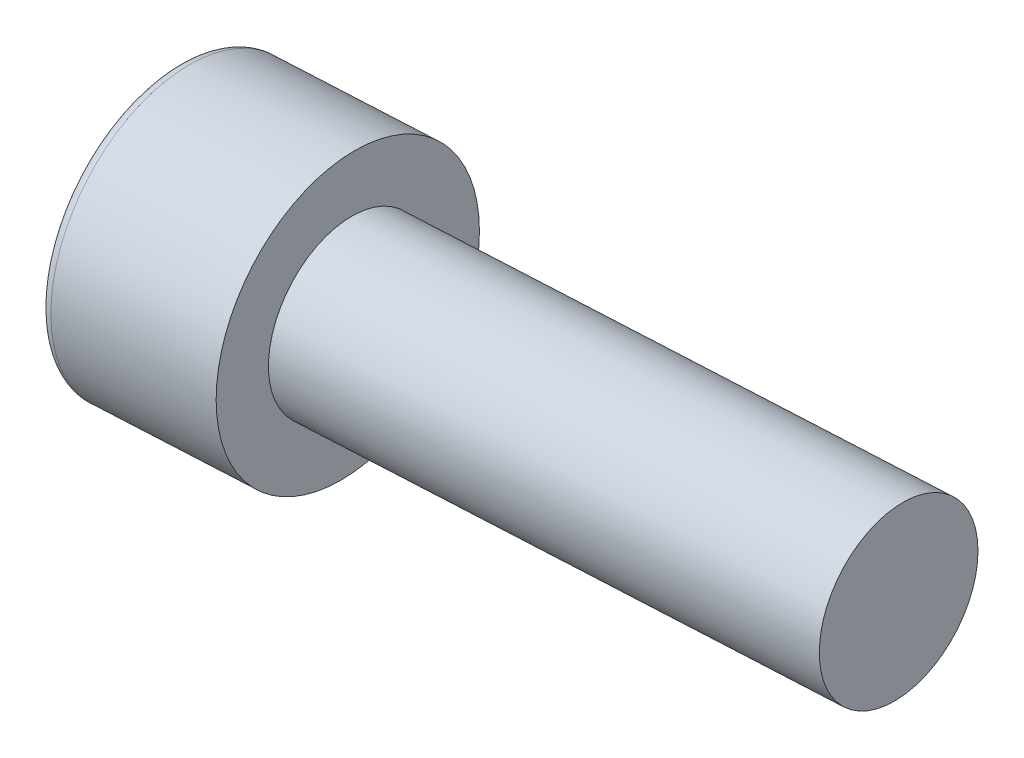
ISO-10303-21;
HEADER;
FILE_DESCRIPTION(('STEP AP214'),'2;1');
FILE_NAME('part.step','',(''),(''),'','','');
FILE_SCHEMA(('AUTOMOTIVE_DESIGN { 1 0 10303 214 1 1 1 1 }'));
ENDSEC;
DATA;
#1=APPLICATION_CONTEXT('core data for automotive mechanical design processes');
#2=APPLICATION_PROTOCOL_DEFINITION('international standard','automotive_design',2000,#1);
#3=PRODUCT_CONTEXT('',#1,'mechanical');
#4=PRODUCT('Part','Part','',(#3));
#5=PRODUCT_RELATED_PRODUCT_CATEGORY('part','',(#4));
#6=PRODUCT_DEFINITION_FORMATION('','',#4);
#7=PRODUCT_DEFINITION_CONTEXT('part definition',#1,'design');
#8=PRODUCT_DEFINITION('design','',#6,#7);
#9=PRODUCT_DEFINITION_SHAPE('','',#8);
#10=(LENGTH_UNIT() NAMED_UNIT(*) SI_UNIT(.MILLI.,.METRE.));
#11=(NAMED_UNIT(*) PLANE_ANGLE_UNIT() SI_UNIT($,.RADIAN.));
#12=(NAMED_UNIT(*) SI_UNIT($,.STERADIAN.) SOLID_ANGLE_UNIT());
#13=UNCERTAINTY_MEASURE_WITH_UNIT(LENGTH_MEASURE(1.E-05),#10,'distance_accuracy_value','');
#14=(GEOMETRIC_REPRESENTATION_CONTEXT(3) GLOBAL_UNCERTAINTY_ASSIGNED_CONTEXT((#13)) GLOBAL_UNIT_ASSIGNED_CONTEXT((#10,
#11,#12)) REPRESENTATION_CONTEXT('',''));
#15=CARTESIAN_POINT('',(0.,0.,0.));
#16=DIRECTION('',(0.,0.,1.));
#17=DIRECTION('',(1.,0.,0.));
#18=AXIS2_PLACEMENT_3D('',#15,#16,#17);
#19=CARTESIAN_POINT('',(215.429162244567,-73.9736896629807,1521.39447916702));
#20=DIRECTION('',(-0.998629534754574,0.,0.0523359562429378));
#21=DIRECTION('',(0.0523359562429378,0.,0.998629534754574));
#22=AXIS2_PLACEMENT_3D('',#19,#20,#21);
#23=PLANE('',#22);
#24=DIRECTION('',(0.0222329845832624,0.905281214491929,0.424230617806564));
#25=VECTOR('',#24,1.);
#26=CARTESIAN_POINT('',(214.886758516541,-71.3424804035878,1511.04479949263));
#27=LINE('',#26,#25);
#28=CARTESIAN_POINT('',(214.886758516541,-71.3424804035883,1511.04479949263));
#29=VERTEX_POINT('',#28);
#30=CARTESIAN_POINT('',(214.976612053979,-67.6838299334338,1512.75930712235));
#31=VERTEX_POINT('',#30);
#32=EDGE_CURVE('E148',#29,#31,#27,.T.);
#33=ORIENTED_EDGE('',*,*,#32,.F.);
#34=DIRECTION('',(-0.0299147157614455,0.820539291690488,-0.570806780419595));
#35=VECTOR('',#34,1.);
#36=CARTESIAN_POINT('',(215.007657400924,-74.6586504701553,1513.35168763094));
#37=LINE('',#36,#35);
#38=CARTESIAN_POINT('',(215.007657400924,-74.6586504701553,1513.35168763094));
#39=VERTEX_POINT('',#38);
#40=EDGE_CURVE('E143',#39,#29,#37,.T.);
#41=ORIENTED_EDGE('',*,*,#40,.F.);
#42=DIRECTION('',(-0.0521477003448079,-0.0847419228014048,-0.995037398226151));
#43=VECTOR('',#42,1.);
#44=CARTESIAN_POINT('',(215.218409822746,-74.3161700665679,1517.37308339898));
#45=LINE('',#44,#43);
#46=CARTESIAN_POINT('',(215.218409822746,-74.3161700665672,1517.37308339898));
#47=VERTEX_POINT('',#46);
#48=EDGE_CURVE('E74',#47,#39,#45,.T.);
#49=ORIENTED_EDGE('',*,*,#48,.F.);
#50=DIRECTION('',(-0.0222329845830004,-0.905281214491918,-0.424230617806601));
#51=VECTOR('',#50,1.);
#52=CARTESIAN_POINT('',(215.308263360183,-70.6575195964134,1519.0875910287));
#53=LINE('',#52,#51);
#54=CARTESIAN_POINT('',(215.308263360183,-70.657519596413,1519.0875910287));
#55=VERTEX_POINT('',#54);
#56=EDGE_CURVE('E71',#55,#47,#53,.T.);
#57=ORIENTED_EDGE('',*,*,#56,.F.);
#58=DIRECTION('',(0.0299147157614389,-0.820539291690485,0.5708067804196));
#59=VECTOR('',#58,1.);
#60=CARTESIAN_POINT('',(215.1873644758,-67.341349529846,1516.78070289039));
#61=LINE('',#60,#59);
#62=CARTESIAN_POINT('',(215.1873644758,-67.341349529846,1516.78070289039));
#63=VERTEX_POINT('',#62);
#64=EDGE_CURVE('E68',#63,#55,#61,.T.);
#65=ORIENTED_EDGE('',*,*,#64,.F.);
#66=DIRECTION('',(0.0521477003445516,0.0847419228014013,0.995037398226165));
#67=VECTOR('',#66,1.);
#68=CARTESIAN_POINT('',(214.976612053979,-67.6838299334334,1512.75930712235));
#69=LINE('',#68,#67);
#70=EDGE_CURVE('E91',#31,#63,#69,.T.);
#71=ORIENTED_EDGE('',*,*,#70,.F.);
#72=EDGE_LOOP('',(#33,#41,#49,#57,#65,#71));
#73=FACE_BOUND('',#72,.T.);
#74=ADVANCED_FACE('F17',(#73),#23,.T.);
#75=CARTESIAN_POINT('',(215.308263360183,-70.6575195964134,1519.0875910287));
#76=DIRECTION('',(-0.0473787580292025,0.424812808997144,-0.904040558050117));
#77=DIRECTION('',(0.,0.905056940546792,0.425290411798903));
#78=AXIS2_PLACEMENT_3D('',#75,#76,#77);
#79=PLANE('',#78);
#80=DIRECTION('',(0.0222329845830301,0.90528121449266,0.424230617805016));
#81=VECTOR('',#80,1.);
#82=CARTESIAN_POINT('',(212.222521218369,-74.3161700665679,1517.53009126772));
#83=LINE('',#82,#81);
#84=CARTESIAN_POINT('',(212.222521218369,-74.316170066566,1517.53009126772));
#85=VERTEX_POINT('',#84);
#86=CARTESIAN_POINT('',(212.312374755891,-70.6575195964129,1519.24459889743));
#87=VERTEX_POINT('',#86);
#88=EDGE_CURVE('E82',#85,#87,#83,.T.);
#89=ORIENTED_EDGE('',*,*,#88,.T.);
#90=DIRECTION('',(-0.998629534754572,-1.85037170770838E-13,0.0523359562429822));
#91=VECTOR('',#90,1.);
#92=CARTESIAN_POINT('',(215.308263360183,-70.6575195964117,1519.0875910287));
#93=LINE('',#92,#91);
#94=EDGE_CURVE('E77',#55,#87,#93,.T.);
#95=ORIENTED_EDGE('',*,*,#94,.F.);
#96=ORIENTED_EDGE('',*,*,#56,.T.);
#97=DIRECTION('',(0.998629534754482,-1.52655665880172E-13,-0.0523359562447048));
#98=VECTOR('',#97,1.);
#99=CARTESIAN_POINT('',(212.222521218369,-74.3161700665675,1517.53009126772));
#100=LINE('',#99,#98);
#101=EDGE_CURVE('E139',#85,#47,#100,.T.);
#102=ORIENTED_EDGE('',*,*,#101,.F.);
#103=EDGE_LOOP('',(#89,#95,#96,#102));
#104=FACE_BOUND('',#103,.T.);
#105=ADVANCED_FACE('F80',(#104),#79,.T.);
#106=CARTESIAN_POINT('',(215.1873644758,-67.341349529846,1516.78070289039));
#107=DIRECTION('',(-0.0429437084655257,-0.571590124820256,-0.819414771108742));
#108=DIRECTION('',(0.,0.820171384589349,-0.572117907341476));
#109=AXIS2_PLACEMENT_3D('',#106,#107,#108);
#110=PLANE('',#109);
#111=DIRECTION('',(-0.998629534754556,0.,0.0523359562432784));
#112=VECTOR('',#111,1.);
#113=CARTESIAN_POINT('',(215.1873644758,-67.3413495298459,1516.78070289039));
#114=LINE('',#113,#112);
#115=CARTESIAN_POINT('',(212.191475871508,-67.3413495298462,1516.93771075912));
#116=VERTEX_POINT('',#115);
#117=EDGE_CURVE('E88',#63,#116,#114,.T.);
#118=ORIENTED_EDGE('',*,*,#117,.F.);
#119=ORIENTED_EDGE('',*,*,#64,.T.);
#120=ORIENTED_EDGE('',*,*,#94,.T.);
#121=DIRECTION('',(-0.0299147157614593,0.820539291690908,-0.570806780418991));
#122=VECTOR('',#121,1.);
#123=CARTESIAN_POINT('',(212.312374755806,-70.6575195964134,1519.24459889744));
#124=LINE('',#123,#122);
#125=EDGE_CURVE('E170',#87,#116,#124,.T.);
#126=ORIENTED_EDGE('',*,*,#125,.T.);
#127=EDGE_LOOP('',(#118,#119,#120,#126));
#128=FACE_BOUND('',#127,.T.);
#129=ADVANCED_FACE('F86',(#128),#110,.T.);
#130=CARTESIAN_POINT('',(214.976612053979,-67.6838299334334,1512.75930712235));
#131=DIRECTION('',(0.00443504956367686,-0.996402933817399,0.0846257869413745));
#132=DIRECTION('',(0.,-0.0846266192340769,-0.996412733417739));
#133=AXIS2_PLACEMENT_3D('',#130,#131,#132);
#134=PLANE('',#133);
#135=DIRECTION('',(-0.998629534754568,1.5265566588594E-13,0.0523359562430555));
#136=VECTOR('',#135,1.);
#137=CARTESIAN_POINT('',(214.976612053979,-67.6838299334349,1512.75930712235));
#138=LINE('',#137,#136);
#139=CARTESIAN_POINT('',(211.980723449687,-67.6838299334336,1512.91631499108));
#140=VERTEX_POINT('',#139);
#141=EDGE_CURVE('E151',#31,#140,#138,.T.);
#142=ORIENTED_EDGE('',*,*,#141,.F.);
#143=ORIENTED_EDGE('',*,*,#70,.T.);
#144=ORIENTED_EDGE('',*,*,#117,.T.);
#145=DIRECTION('',(-0.0521477003446025,-0.0847419228013853,-0.995037398226164));
#146=VECTOR('',#145,1.);
#147=CARTESIAN_POINT('',(212.191475871423,-67.341349529846,1516.93771075913));
#148=LINE('',#147,#146);
#149=EDGE_CURVE('E171',#116,#140,#148,.T.);
#150=ORIENTED_EDGE('',*,*,#149,.T.);
#151=EDGE_LOOP('',(#142,#143,#144,#150));
#152=FACE_BOUND('',#151,.T.);
#153=ADVANCED_FACE('F155',(#152),#134,.T.);
#154=CARTESIAN_POINT('',(214.886758516541,-71.3424804035878,1511.04479949263));
#155=DIRECTION('',(0.0473787580292025,-0.424812808997144,0.904040558050117));
#156=DIRECTION('',(0.,-0.905056940546792,-0.425290411798903));
#157=AXIS2_PLACEMENT_3D('',#154,#155,#156);
#158=PLANE('',#157);
#159=DIRECTION('',(-0.998629534754621,1.39240471005127E-12,0.0523359562420468));
#160=VECTOR('',#159,1.);
#161=CARTESIAN_POINT('',(214.886758516541,-71.3424804035896,1511.04479949263));
#162=LINE('',#161,#160);
#163=CARTESIAN_POINT('',(211.89086991225,-71.3424804035889,1511.20180736136));
#164=VERTEX_POINT('',#163);
#165=EDGE_CURVE('E146',#29,#164,#162,.T.);
#166=ORIENTED_EDGE('',*,*,#165,.F.);
#167=ORIENTED_EDGE('',*,*,#32,.T.);
#168=ORIENTED_EDGE('',*,*,#141,.T.);
#169=DIRECTION('',(-0.0222329845831834,-0.905281214491322,-0.424230617807864));
#170=VECTOR('',#169,1.);
#171=CARTESIAN_POINT('',(211.980723449602,-67.6838299334334,1512.91631499109));
#172=LINE('',#171,#170);
#173=EDGE_CURVE('E161',#140,#164,#172,.T.);
#174=ORIENTED_EDGE('',*,*,#173,.T.);
#175=EDGE_LOOP('',(#166,#167,#168,#174));
#176=FACE_BOUND('',#175,.T.);
#177=ADVANCED_FACE('F159',(#176),#158,.T.);
#178=CARTESIAN_POINT('',(215.007657400924,-74.6586504701553,1513.35168763094));
#179=DIRECTION('',(0.0429437084655257,0.571590124820256,0.819414771108742));
#180=DIRECTION('',(0.,-0.820171384589349,0.572117907341476));
#181=AXIS2_PLACEMENT_3D('',#178,#179,#180);
#182=PLANE('',#181);
#183=DIRECTION('',(-0.998629534754552,0.,0.0523359562433696));
#184=VECTOR('',#183,1.);
#185=CARTESIAN_POINT('',(215.007657400924,-74.6586504701554,1513.35168763094));
#186=LINE('',#185,#184);
#187=CARTESIAN_POINT('',(212.011768796633,-74.6586504701556,1513.50869549967));
#188=VERTEX_POINT('',#187);
#189=EDGE_CURVE('E141',#39,#188,#186,.T.);
#190=ORIENTED_EDGE('',*,*,#189,.F.);
#191=ORIENTED_EDGE('',*,*,#40,.T.);
#192=ORIENTED_EDGE('',*,*,#165,.T.);
#193=DIRECTION('',(0.0299147157615468,-0.820539291689755,0.570806780420644));
#194=VECTOR('',#193,1.);
#195=CARTESIAN_POINT('',(211.890869912164,-71.3424804035878,1511.20180736136));
#196=LINE('',#195,#194);
#197=EDGE_CURVE('E35',#164,#188,#196,.T.);
#198=ORIENTED_EDGE('',*,*,#197,.T.);
#199=EDGE_LOOP('',(#190,#191,#192,#198));
#200=FACE_BOUND('',#199,.T.);
#201=ADVANCED_FACE('F162',(#200),#182,.T.);
#202=CARTESIAN_POINT('',(215.218409822746,-74.3161700665679,1517.37308339898));
#203=DIRECTION('',(-0.00443504956367683,0.9964029338174,-0.084625786941374));
#204=DIRECTION('',(0.,0.0846266192340763,0.996412733417739));
#205=AXIS2_PLACEMENT_3D('',#202,#203,#204);
#206=PLANE('',#205);
#207=ORIENTED_EDGE('',*,*,#101,.T.);
#208=ORIENTED_EDGE('',*,*,#48,.T.);
#209=ORIENTED_EDGE('',*,*,#189,.T.);
#210=DIRECTION('',(0.052147700344606,0.0847419228012982,0.995037398226171));
#211=VECTOR('',#210,1.);
#212=CARTESIAN_POINT('',(212.011768796547,-74.6586504701553,1513.50869549968));
#213=LINE('',#212,#211);
#214=EDGE_CURVE('E107',#188,#85,#213,.T.);
#215=ORIENTED_EDGE('',*,*,#214,.T.);
#216=EDGE_LOOP('',(#207,#208,#209,#215));
#217=FACE_BOUND('',#216,.T.);
#218=ADVANCED_FACE('F166',(#217),#206,.T.);
#219=CARTESIAN_POINT('',(212.101622333985,-71.,1515.2232031294));
#220=DIRECTION('',(0.998629534754574,0.,-0.0523359562429378));
#221=DIRECTION('',(-0.0523359562429378,0.,-0.998629534754574));
#222=AXIS2_PLACEMENT_3D('',#219,#220,#221);
#223=PLANE('',#222);
#224=ORIENTED_EDGE('',*,*,#197,.F.);
#225=ORIENTED_EDGE('',*,*,#173,.F.);
#226=ORIENTED_EDGE('',*,*,#149,.F.);
#227=ORIENTED_EDGE('',*,*,#125,.F.);
#228=ORIENTED_EDGE('',*,*,#88,.F.);
#229=ORIENTED_EDGE('',*,*,#214,.F.);
#230=EDGE_LOOP('',(#224,#225,#226,#227,#228,#229));
#231=FACE_BOUND('',#230,.T.);
#232=CARTESIAN_POINT('',(212.101622333985,-71.,1515.2232031294));
#233=DIRECTION('',(0.998629534754574,0.,-0.0523359562429378));
#234=DIRECTION('',(0.0473787580292029,-0.424812808997081,0.904040558050146));
#235=AXIS2_PLACEMENT_3D('',#232,#233,#234);
#236=CIRCLE('',#235,6.13500000000082);
#237=CARTESIAN_POINT('',(212.392291014494,-73.6062265831974,1520.76949195304));
#238=VERTEX_POINT('',#237);
#239=EDGE_CURVE('E102',#238,#238,#236,.T.);
#240=ORIENTED_EDGE('',*,*,#239,.F.);
#241=EDGE_LOOP('',(#240));
#242=FACE_BOUND('',#241,.T.);
#243=ADVANCED_FACE('F122',(#231,#242),#223,.F.);
#244=CARTESIAN_POINT('',(212.600937101362,-71.,1515.19703515128));
#245=DIRECTION('',(0.998629534754574,0.,-0.0523359562429378));
#246=DIRECTION('',(-0.0473787580292026,0.424812808997142,-0.904040558050118));
#247=AXIS2_PLACEMENT_3D('',#244,#245,#246);
#248=TOROIDAL_SURFACE('',#247,6.13500000000003,0.5);
#249=CARTESIAN_POINT('',(212.600937101362,-71.,1515.19703515128));
#250=DIRECTION('',(0.998629534754574,0.,-0.0523359562429378));
#251=DIRECTION('',(-0.0523359562429378,0.,-0.998629534754574));
#252=AXIS2_PLACEMENT_3D('',#249,#250,#251);
#253=CIRCLE('',#252,6.635);
#254=CARTESIAN_POINT('',(212.25368803169,-71.,1508.57112818818));
#255=VERTEX_POINT('',#254);
#256=EDGE_CURVE('E98',#255,#255,#253,.T.);
#257=ORIENTED_EDGE('',*,*,#256,.F.);
#258=EDGE_LOOP('',(#257));
#259=FACE_BOUND('',#258,.T.);
#260=ORIENTED_EDGE('',*,*,#239,.T.);
#261=EDGE_LOOP('',(#260));
#262=FACE_BOUND('',#261,.T.);
#263=ADVANCED_FACE('F116',(#259,#262),#248,.T.);
#264=CARTESIAN_POINT('',(245.056396980886,-71.,1513.49611657338));
#265=DIRECTION('',(0.998629534754574,0.,-0.0523359562429378));
#266=DIRECTION('',(-0.0523359562429378,0.,-0.998629534754574));
#267=AXIS2_PLACEMENT_3D('',#264,#265,#266);
#268=CYLINDRICAL_SURFACE('',#267,6.635);
#269=CARTESIAN_POINT('',(220.090658612021,-71.,1514.80451547945));
#270=DIRECTION('',(0.998629534754574,0.,-0.0523359562429378));
#271=DIRECTION('',(-0.0523359562429378,0.,-0.998629534754574));
#272=AXIS2_PLACEMENT_3D('',#269,#270,#271);
#273=CIRCLE('',#272,6.635);
#274=CARTESIAN_POINT('',(219.743409542349,-71.,1508.17860851636));
#275=VERTEX_POINT('',#274);
#276=EDGE_CURVE('E20',#275,#275,#273,.F.);
#277=ORIENTED_EDGE('',*,*,#276,.T.);
#278=EDGE_LOOP('',(#277));
#279=FACE_BOUND('',#278,.T.);
#280=ORIENTED_EDGE('',*,*,#256,.T.);
#281=EDGE_LOOP('',(#280));
#282=FACE_BOUND('',#281,.T.);
#283=ADVANCED_FACE('F121',(#279,#282),#268,.T.);
#284=CARTESIAN_POINT('',(244.967465042553,-74.6211248579683,1511.79919410215));
#285=DIRECTION('',(-0.998629534754574,0.,0.0523359562429378));
#286=DIRECTION('',(0.0523359562429378,0.,0.998629534754574));
#287=AXIS2_PLACEMENT_3D('',#284,#285,#286);
#288=PLANE('',#287);
#289=CARTESIAN_POINT('',(245.056396980886,-71.,1513.49611657338));
#290=DIRECTION('',(0.998629534754574,0.,-0.0523359562429378));
#291=DIRECTION('',(-0.0523359562429378,0.,-0.998629534754574));
#292=AXIS2_PLACEMENT_3D('',#289,#290,#291);
#293=CIRCLE('',#292,4.);
#294=CARTESIAN_POINT('',(244.847053155914,-71.,1509.50159843436));
#295=VERTEX_POINT('',#294);
#296=EDGE_CURVE('E26',#295,#295,#293,.F.);
#297=ORIENTED_EDGE('',*,*,#296,.F.);
#298=EDGE_LOOP('',(#297));
#299=FACE_BOUND('',#298,.T.);
#300=ADVANCED_FACE('F197',(#299),#288,.F.);
#301=CARTESIAN_POINT('',(219.943142759313,-77.0065408581545,1511.98974533031));
#302=DIRECTION('',(-0.998629534754574,0.,0.0523359562429378));
#303=DIRECTION('',(0.0523359562429378,0.,0.998629534754574));
#304=AXIS2_PLACEMENT_3D('',#301,#302,#303);
#305=PLANE('',#304);
#306=ORIENTED_EDGE('',*,*,#276,.F.);
#307=EDGE_LOOP('',(#306));
#308=FACE_BOUND('',#307,.T.);
#309=CARTESIAN_POINT('',(220.090658612021,-71.,1514.80451547945));
#310=DIRECTION('',(0.998629534754574,0.,-0.0523359562429378));
#311=DIRECTION('',(-0.0523359562429378,0.,-0.998629534754574));
#312=AXIS2_PLACEMENT_3D('',#309,#310,#311);
#313=CIRCLE('',#312,4.);
#314=CARTESIAN_POINT('',(219.881314787049,-71.,1510.80999734044));
#315=VERTEX_POINT('',#314);
#316=EDGE_CURVE('E11',#315,#315,#313,.T.);
#317=ORIENTED_EDGE('',*,*,#316,.F.);
#318=EDGE_LOOP('',(#317));
#319=FACE_BOUND('',#318,.T.);
#320=ADVANCED_FACE('F191',(#308,#319),#305,.F.);
#321=CARTESIAN_POINT('',(245.056396980886,-71.,1513.49611657338));
#322=DIRECTION('',(0.998629534754574,0.,-0.0523359562429378));
#323=DIRECTION('',(-0.0523359562429378,0.,-0.998629534754574));
#324=AXIS2_PLACEMENT_3D('',#321,#322,#323);
#325=CYLINDRICAL_SURFACE('',#324,4.);
#326=ORIENTED_EDGE('',*,*,#316,.T.);
#327=EDGE_LOOP('',(#326));
#328=FACE_BOUND('',#327,.T.);
#329=ORIENTED_EDGE('',*,*,#296,.T.);
#330=EDGE_LOOP('',(#329));
#331=FACE_BOUND('',#330,.T.);
#332=ADVANCED_FACE('F189',(#328,#331),#325,.T.);
#333=CLOSED_SHELL('',(#74,#105,#129,#153,#177,#201,#218,#243,#263,#283,#300,#320,#332));
#334=MANIFOLD_SOLID_BREP('B1',#333);
#335=ADVANCED_BREP_SHAPE_REPRESENTATION('',(#18,#334),#14);
#336=SHAPE_DEFINITION_REPRESENTATION(#9,#335);
ENDSEC;
END-ISO-10303-21;
